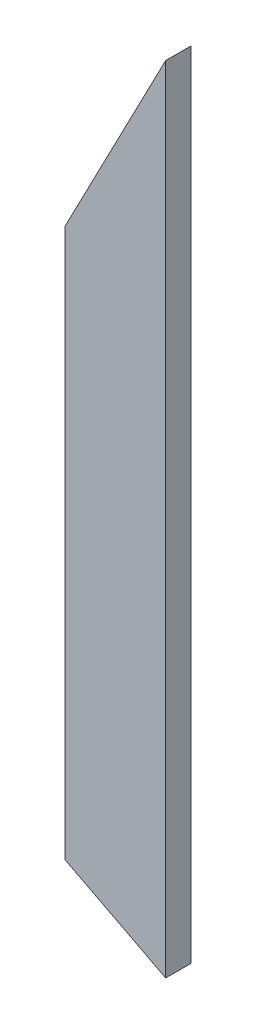
ISO-10303-21;
HEADER;
FILE_DESCRIPTION(('STEP AP214'),'2;1');
FILE_NAME('part.step','',(''),(''),'','','');
FILE_SCHEMA(('AUTOMOTIVE_DESIGN { 1 0 10303 214 1 1 1 1 }'));
ENDSEC;
DATA;
#1=APPLICATION_CONTEXT('core data for automotive mechanical design processes');
#2=APPLICATION_PROTOCOL_DEFINITION('international standard','automotive_design',2000,#1);
#3=PRODUCT_CONTEXT('',#1,'mechanical');
#4=PRODUCT('Part','Part','',(#3));
#5=PRODUCT_RELATED_PRODUCT_CATEGORY('part','',(#4));
#6=PRODUCT_DEFINITION_FORMATION('','',#4);
#7=PRODUCT_DEFINITION_CONTEXT('part definition',#1,'design');
#8=PRODUCT_DEFINITION('design','',#6,#7);
#9=PRODUCT_DEFINITION_SHAPE('','',#8);
#10=(LENGTH_UNIT() NAMED_UNIT(*) SI_UNIT(.MILLI.,.METRE.));
#11=(NAMED_UNIT(*) PLANE_ANGLE_UNIT() SI_UNIT($,.RADIAN.));
#12=(NAMED_UNIT(*) SI_UNIT($,.STERADIAN.) SOLID_ANGLE_UNIT());
#13=UNCERTAINTY_MEASURE_WITH_UNIT(LENGTH_MEASURE(1.E-05),#10,'distance_accuracy_value','');
#14=(GEOMETRIC_REPRESENTATION_CONTEXT(3) GLOBAL_UNCERTAINTY_ASSIGNED_CONTEXT((#13)) GLOBAL_UNIT_ASSIGNED_CONTEXT((#10,
#11,#12)) REPRESENTATION_CONTEXT('',''));
#15=CARTESIAN_POINT('',(0.,0.,0.));
#16=DIRECTION('',(0.,0.,1.));
#17=DIRECTION('',(1.,0.,0.));
#18=AXIS2_PLACEMENT_3D('',#15,#16,#17);
#19=CARTESIAN_POINT('',(-76.5979894854749,-147.996167111224,12.7));
#20=DIRECTION('',(-0.459651320530117,-0.88809946714032,0.));
#21=DIRECTION('',(0.88809946714032,-0.459651320530117,0.));
#22=AXIS2_PLACEMENT_3D('',#19,#20,#21);
#23=PLANE('',#22);
#24=DIRECTION('',(-0.88809946714032,0.459651320530117,0.));
#25=VECTOR('',#24,1.);
#26=CARTESIAN_POINT('',(-76.5979894854749,-147.996167111224,0.));
#27=LINE('',#26,#25);
#28=CARTESIAN_POINT('',(25.4,-200.787,0.));
#29=VERTEX_POINT('',#28);
#30=CARTESIAN_POINT('',(-25.4,-174.494576744621,0.));
#31=VERTEX_POINT('',#30);
#32=EDGE_CURVE('E110',#29,#31,#27,.T.);
#33=ORIENTED_EDGE('',*,*,#32,.F.);
#34=DIRECTION('',(0.,0.,-1.));
#35=VECTOR('',#34,1.);
#36=CARTESIAN_POINT('',(25.4,-200.787,12.7));
#37=LINE('',#36,#35);
#38=CARTESIAN_POINT('',(25.4,-200.787,12.7));
#39=VERTEX_POINT('',#38);
#40=EDGE_CURVE('E11',#39,#29,#37,.T.);
#41=ORIENTED_EDGE('',*,*,#40,.F.);
#42=DIRECTION('',(-0.88809946714032,0.459651320530117,0.));
#43=VECTOR('',#42,1.);
#44=CARTESIAN_POINT('',(-76.5979894854749,-147.996167111224,12.7));
#45=LINE('',#44,#43);
#46=CARTESIAN_POINT('',(-25.4,-174.494576744621,12.7));
#47=VERTEX_POINT('',#46);
#48=EDGE_CURVE('E101',#39,#47,#45,.T.);
#49=ORIENTED_EDGE('',*,*,#48,.T.);
#50=DIRECTION('',(0.,0.,-1.));
#51=VECTOR('',#50,1.);
#52=CARTESIAN_POINT('',(-25.4,-174.494576744621,12.7));
#53=LINE('',#52,#51);
#54=EDGE_CURVE('E80',#47,#31,#53,.T.);
#55=ORIENTED_EDGE('',*,*,#54,.T.);
#56=EDGE_LOOP('',(#33,#41,#49,#55));
#57=FACE_BOUND('',#56,.T.);
#58=ADVANCED_FACE('F41',(#57),#23,.T.);
#59=CARTESIAN_POINT('',(25.4,0.,12.7));
#60=DIRECTION('',(1.,0.,0.));
#61=DIRECTION('',(0.,1.,0.));
#62=AXIS2_PLACEMENT_3D('',#59,#60,#61);
#63=PLANE('',#62);
#64=DIRECTION('',(0.,-1.,0.));
#65=VECTOR('',#64,1.);
#66=CARTESIAN_POINT('',(25.4,0.,0.));
#67=LINE('',#66,#65);
#68=CARTESIAN_POINT('',(25.4,200.787,0.));
#69=VERTEX_POINT('',#68);
#70=EDGE_CURVE('E93',#69,#29,#67,.T.);
#71=ORIENTED_EDGE('',*,*,#70,.F.);
#72=DIRECTION('',(0.,0.,-1.));
#73=VECTOR('',#72,1.);
#74=CARTESIAN_POINT('',(25.4,200.787,12.7));
#75=LINE('',#74,#73);
#76=CARTESIAN_POINT('',(25.4,200.787,12.7));
#77=VERTEX_POINT('',#76);
#78=EDGE_CURVE('E50',#77,#69,#75,.T.);
#79=ORIENTED_EDGE('',*,*,#78,.F.);
#80=DIRECTION('',(0.,-1.,0.));
#81=VECTOR('',#80,1.);
#82=CARTESIAN_POINT('',(25.4,0.,12.7));
#83=LINE('',#82,#81);
#84=EDGE_CURVE('E91',#77,#39,#83,.T.);
#85=ORIENTED_EDGE('',*,*,#84,.T.);
#86=ORIENTED_EDGE('',*,*,#40,.T.);
#87=EDGE_LOOP('',(#71,#79,#85,#86));
#88=FACE_BOUND('',#87,.T.);
#89=ADVANCED_FACE('F89',(#88),#63,.T.);
#90=CARTESIAN_POINT('',(-62.1284093914882,32.2696863208625,12.7));
#91=DIRECTION('',(0.887433536077025,-0.460935699469924,0.));
#92=DIRECTION('',(0.460935699469924,0.887433536077025,0.));
#93=AXIS2_PLACEMENT_3D('',#90,#91,#92);
#94=PLANE('',#93);
#95=DIRECTION('',(-0.460935699469924,-0.887433536077025,0.));
#96=VECTOR('',#95,1.);
#97=CARTESIAN_POINT('',(-62.1284093914882,32.2696863208625,0.));
#98=LINE('',#97,#96);
#99=CARTESIAN_POINT('',(-25.4,102.982417528829,0.));
#100=VERTEX_POINT('',#99);
#101=EDGE_CURVE('E73',#69,#100,#98,.T.);
#102=ORIENTED_EDGE('',*,*,#101,.T.);
#103=DIRECTION('',(0.,0.,-1.));
#104=VECTOR('',#103,1.);
#105=CARTESIAN_POINT('',(-25.4,102.982417528829,12.7));
#106=LINE('',#105,#104);
#107=CARTESIAN_POINT('',(-25.4,102.982417528829,12.7));
#108=VERTEX_POINT('',#107);
#109=EDGE_CURVE('E95',#108,#100,#106,.T.);
#110=ORIENTED_EDGE('',*,*,#109,.F.);
#111=DIRECTION('',(-0.460935699469924,-0.887433536077025,0.));
#112=VECTOR('',#111,1.);
#113=CARTESIAN_POINT('',(-62.1284093914882,32.2696863208625,12.7));
#114=LINE('',#113,#112);
#115=EDGE_CURVE('E96',#77,#108,#114,.T.);
#116=ORIENTED_EDGE('',*,*,#115,.F.);
#117=ORIENTED_EDGE('',*,*,#78,.T.);
#118=EDGE_LOOP('',(#102,#110,#116,#117));
#119=FACE_BOUND('',#118,.T.);
#120=ADVANCED_FACE('F97',(#119),#94,.F.);
#121=CARTESIAN_POINT('',(-25.4,0.,12.7));
#122=DIRECTION('',(1.,0.,0.));
#123=DIRECTION('',(0.,1.,0.));
#124=AXIS2_PLACEMENT_3D('',#121,#122,#123);
#125=PLANE('',#124);
#126=DIRECTION('',(0.,-1.,0.));
#127=VECTOR('',#126,1.);
#128=CARTESIAN_POINT('',(-25.4,0.,0.));
#129=LINE('',#128,#127);
#130=EDGE_CURVE('E105',#100,#31,#129,.T.);
#131=ORIENTED_EDGE('',*,*,#130,.T.);
#132=ORIENTED_EDGE('',*,*,#54,.F.);
#133=DIRECTION('',(0.,-1.,0.));
#134=VECTOR('',#133,1.);
#135=CARTESIAN_POINT('',(-25.4,0.,12.7));
#136=LINE('',#135,#134);
#137=EDGE_CURVE('E58',#108,#47,#136,.T.);
#138=ORIENTED_EDGE('',*,*,#137,.F.);
#139=ORIENTED_EDGE('',*,*,#109,.T.);
#140=EDGE_LOOP('',(#131,#132,#138,#139));
#141=FACE_BOUND('',#140,.T.);
#142=ADVANCED_FACE('F125',(#141),#125,.F.);
#143=CARTESIAN_POINT('',(0.,0.,12.7));
#144=DIRECTION('',(0.,0.,1.));
#145=DIRECTION('',(1.,0.,0.));
#146=AXIS2_PLACEMENT_3D('',#143,#144,#145);
#147=PLANE('',#146);
#148=ORIENTED_EDGE('',*,*,#48,.F.);
#149=ORIENTED_EDGE('',*,*,#84,.F.);
#150=ORIENTED_EDGE('',*,*,#115,.T.);
#151=ORIENTED_EDGE('',*,*,#137,.T.);
#152=EDGE_LOOP('',(#148,#149,#150,#151));
#153=FACE_BOUND('',#152,.T.);
#154=ADVANCED_FACE('F100',(#153),#147,.T.);
#155=CARTESIAN_POINT('',(0.,0.,0.));
#156=DIRECTION('',(0.,0.,1.));
#157=DIRECTION('',(1.,0.,0.));
#158=AXIS2_PLACEMENT_3D('',#155,#156,#157);
#159=PLANE('',#158);
#160=ORIENTED_EDGE('',*,*,#32,.T.);
#161=ORIENTED_EDGE('',*,*,#130,.F.);
#162=ORIENTED_EDGE('',*,*,#101,.F.);
#163=ORIENTED_EDGE('',*,*,#70,.T.);
#164=EDGE_LOOP('',(#160,#161,#162,#163));
#165=FACE_BOUND('',#164,.T.);
#166=ADVANCED_FACE('F127',(#165),#159,.F.);
#167=CLOSED_SHELL('',(#58,#89,#120,#142,#154,#166));
#168=MANIFOLD_SOLID_BREP('B2',#167);
#169=ADVANCED_BREP_SHAPE_REPRESENTATION('',(#18,#168),#14);
#170=SHAPE_DEFINITION_REPRESENTATION(#9,#169);
ENDSEC;
END-ISO-10303-21;
